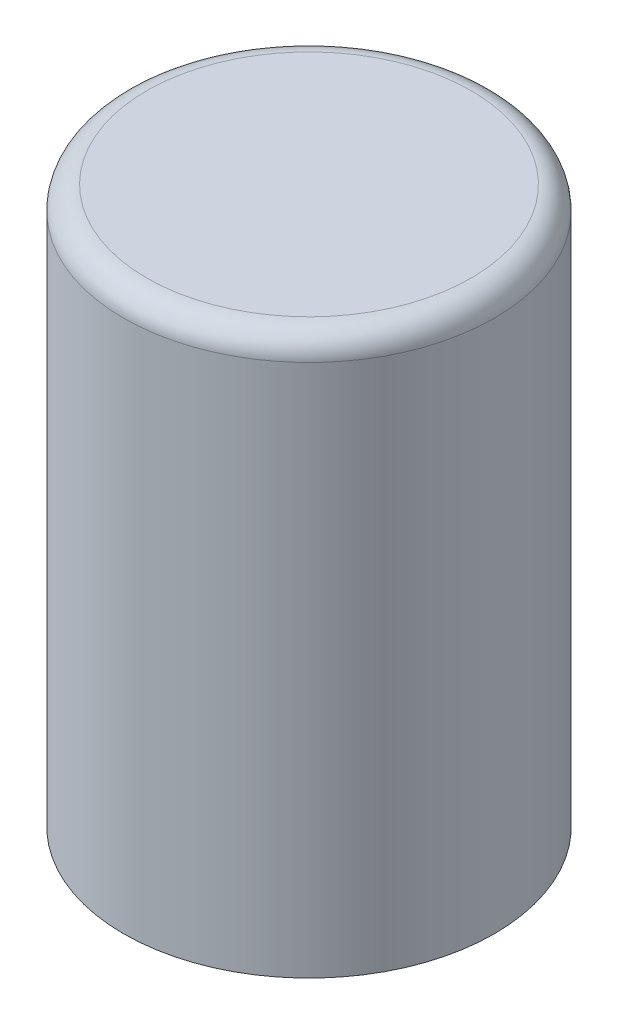
ISO-10303-21;
HEADER;
FILE_DESCRIPTION(('STEP AP214'),'2;1');
FILE_NAME('part.step','',(''),(''),'','','');
FILE_SCHEMA(('AUTOMOTIVE_DESIGN { 1 0 10303 214 1 1 1 1 }'));
ENDSEC;
DATA;
#1=APPLICATION_CONTEXT('core data for automotive mechanical design processes');
#2=APPLICATION_PROTOCOL_DEFINITION('international standard','automotive_design',2000,#1);
#3=PRODUCT_CONTEXT('',#1,'mechanical');
#4=PRODUCT('Part','Part','',(#3));
#5=PRODUCT_RELATED_PRODUCT_CATEGORY('part','',(#4));
#6=PRODUCT_DEFINITION_FORMATION('','',#4);
#7=PRODUCT_DEFINITION_CONTEXT('part definition',#1,'design');
#8=PRODUCT_DEFINITION('design','',#6,#7);
#9=PRODUCT_DEFINITION_SHAPE('','',#8);
#10=(LENGTH_UNIT() NAMED_UNIT(*) SI_UNIT(.MILLI.,.METRE.));
#11=(NAMED_UNIT(*) PLANE_ANGLE_UNIT() SI_UNIT($,.RADIAN.));
#12=(NAMED_UNIT(*) SI_UNIT($,.STERADIAN.) SOLID_ANGLE_UNIT());
#13=UNCERTAINTY_MEASURE_WITH_UNIT(LENGTH_MEASURE(1.E-05),#10,'distance_accuracy_value','');
#14=(GEOMETRIC_REPRESENTATION_CONTEXT(3) GLOBAL_UNCERTAINTY_ASSIGNED_CONTEXT((#13)) GLOBAL_UNIT_ASSIGNED_CONTEXT((#10,
#11,#12)) REPRESENTATION_CONTEXT('',''));
#15=CARTESIAN_POINT('',(0.,0.,0.));
#16=DIRECTION('',(0.,0.,1.));
#17=DIRECTION('',(1.,0.,0.));
#18=AXIS2_PLACEMENT_3D('',#15,#16,#17);
#19=CARTESIAN_POINT('',(0.,6.,0.));
#20=DIRECTION('',(0.,-1.,0.));
#21=DIRECTION('',(0.,0.,-1.));
#22=AXIS2_PLACEMENT_3D('',#19,#20,#21);
#23=CYLINDRICAL_SURFACE('',#22,2.);
#24=CARTESIAN_POINT('',(0.,5.75,0.));
#25=DIRECTION('',(0.,1.,0.));
#26=DIRECTION('',(0.,0.,1.));
#27=AXIS2_PLACEMENT_3D('',#24,#25,#26);
#28=CIRCLE('',#27,2.);
#29=CARTESIAN_POINT('',(0.,5.75,2.));
#30=VERTEX_POINT('',#29);
#31=EDGE_CURVE('E10',#30,#30,#28,.F.);
#32=ORIENTED_EDGE('',*,*,#31,.T.);
#33=EDGE_LOOP('',(#32));
#34=FACE_BOUND('',#33,.T.);
#35=CARTESIAN_POINT('',(0.,0.,0.));
#36=DIRECTION('',(0.,1.,0.));
#37=DIRECTION('',(0.,0.,1.));
#38=AXIS2_PLACEMENT_3D('',#35,#36,#37);
#39=CIRCLE('',#38,2.);
#40=CARTESIAN_POINT('',(0.,0.,2.));
#41=VERTEX_POINT('',#40);
#42=EDGE_CURVE('E48',#41,#41,#39,.T.);
#43=ORIENTED_EDGE('',*,*,#42,.T.);
#44=EDGE_LOOP('',(#43));
#45=FACE_BOUND('',#44,.T.);
#46=ADVANCED_FACE('F40',(#34,#45),#23,.T.);
#47=CARTESIAN_POINT('',(0.,6.,0.));
#48=DIRECTION('',(0.,1.,0.));
#49=DIRECTION('',(0.,0.,1.));
#50=AXIS2_PLACEMENT_3D('',#47,#48,#49);
#51=PLANE('',#50);
#52=CARTESIAN_POINT('',(0.,6.,0.));
#53=DIRECTION('',(0.,1.,0.));
#54=DIRECTION('',(0.,0.,1.));
#55=AXIS2_PLACEMENT_3D('',#52,#53,#54);
#56=CIRCLE('',#55,1.75);
#57=CARTESIAN_POINT('',(0.,6.,1.75));
#58=VERTEX_POINT('',#57);
#59=EDGE_CURVE('E42',#58,#58,#56,.T.);
#60=ORIENTED_EDGE('',*,*,#59,.T.);
#61=EDGE_LOOP('',(#60));
#62=FACE_BOUND('',#61,.T.);
#63=ADVANCED_FACE('F59',(#62),#51,.T.);
#64=CARTESIAN_POINT('',(0.,0.,0.));
#65=DIRECTION('',(0.,1.,0.));
#66=DIRECTION('',(0.,0.,1.));
#67=AXIS2_PLACEMENT_3D('',#64,#65,#66);
#68=PLANE('',#67);
#69=ORIENTED_EDGE('',*,*,#42,.F.);
#70=EDGE_LOOP('',(#69));
#71=FACE_BOUND('',#70,.T.);
#72=ADVANCED_FACE('F57',(#71),#68,.F.);
#73=CARTESIAN_POINT('',(0.,5.75,0.));
#74=DIRECTION('',(0.,1.,0.));
#75=DIRECTION('',(0.,0.,1.));
#76=AXIS2_PLACEMENT_3D('',#73,#74,#75);
#77=TOROIDAL_SURFACE('',#76,1.75,0.25);
#78=ORIENTED_EDGE('',*,*,#31,.F.);
#79=EDGE_LOOP('',(#78));
#80=FACE_BOUND('',#79,.T.);
#81=ORIENTED_EDGE('',*,*,#59,.F.);
#82=EDGE_LOOP('',(#81));
#83=FACE_BOUND('',#82,.T.);
#84=ADVANCED_FACE('F39',(#80,#83),#77,.T.);
#85=CLOSED_SHELL('',(#46,#63,#72,#84));
#86=MANIFOLD_SOLID_BREP('B2',#85);
#87=ADVANCED_BREP_SHAPE_REPRESENTATION('',(#18,#86),#14);
#88=SHAPE_DEFINITION_REPRESENTATION(#9,#87);
ENDSEC;
END-ISO-10303-21;
